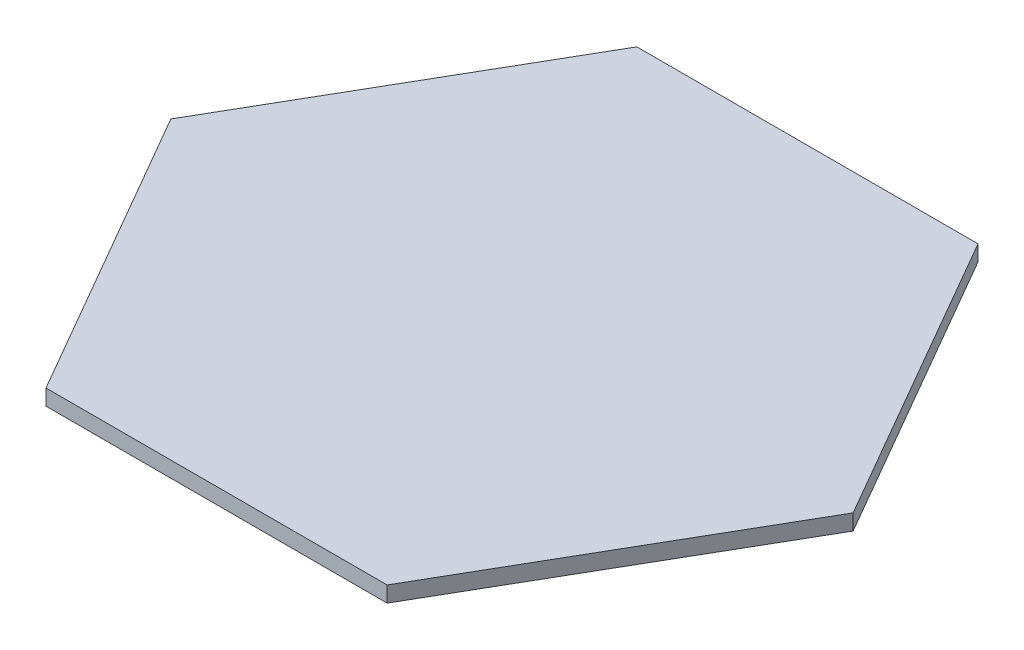
ISO-10303-21;
HEADER;
FILE_DESCRIPTION(('STEP AP214'),'2;1');
FILE_NAME('part.step','',(''),(''),'','','');
FILE_SCHEMA(('AUTOMOTIVE_DESIGN { 1 0 10303 214 1 1 1 1 }'));
ENDSEC;
DATA;
#1=APPLICATION_CONTEXT('core data for automotive mechanical design processes');
#2=APPLICATION_PROTOCOL_DEFINITION('international standard','automotive_design',2000,#1);
#3=PRODUCT_CONTEXT('',#1,'mechanical');
#4=PRODUCT('Part','Part','',(#3));
#5=PRODUCT_RELATED_PRODUCT_CATEGORY('part','',(#4));
#6=PRODUCT_DEFINITION_FORMATION('','',#4);
#7=PRODUCT_DEFINITION_CONTEXT('part definition',#1,'design');
#8=PRODUCT_DEFINITION('design','',#6,#7);
#9=PRODUCT_DEFINITION_SHAPE('','',#8);
#10=(LENGTH_UNIT() NAMED_UNIT(*) SI_UNIT(.MILLI.,.METRE.));
#11=(NAMED_UNIT(*) PLANE_ANGLE_UNIT() SI_UNIT($,.RADIAN.));
#12=(NAMED_UNIT(*) SI_UNIT($,.STERADIAN.) SOLID_ANGLE_UNIT());
#13=UNCERTAINTY_MEASURE_WITH_UNIT(LENGTH_MEASURE(1.E-05),#10,'distance_accuracy_value','');
#14=(GEOMETRIC_REPRESENTATION_CONTEXT(3) GLOBAL_UNCERTAINTY_ASSIGNED_CONTEXT((#13)) GLOBAL_UNIT_ASSIGNED_CONTEXT((#10,
#11,#12)) REPRESENTATION_CONTEXT('',''));
#15=CARTESIAN_POINT('',(0.,0.,0.));
#16=DIRECTION('',(0.,0.,1.));
#17=DIRECTION('',(1.,0.,0.));
#18=AXIS2_PLACEMENT_3D('',#15,#16,#17);
#19=CARTESIAN_POINT('',(32.5000000000007,3.,56.2916512459881));
#20=DIRECTION('',(-0.866025403784441,0.,-0.499999999999995));
#21=DIRECTION('',(-0.499999999999995,0.,0.866025403784442));
#22=AXIS2_PLACEMENT_3D('',#19,#20,#21);
#23=PLANE('',#22);
#24=DIRECTION('',(0.499999999999995,0.,-0.866025403784442));
#25=VECTOR('',#24,1.);
#26=CARTESIAN_POINT('',(32.5000000000007,0.,56.2916512459881));
#27=LINE('',#26,#25);
#28=CARTESIAN_POINT('',(32.5000000000007,0.,56.2916512459881));
#29=VERTEX_POINT('',#28);
#30=CARTESIAN_POINT('',(65.,0.,0.));
#31=VERTEX_POINT('',#30);
#32=EDGE_CURVE('E119',#29,#31,#27,.T.);
#33=ORIENTED_EDGE('',*,*,#32,.T.);
#34=DIRECTION('',(0.,-1.,0.));
#35=VECTOR('',#34,1.);
#36=CARTESIAN_POINT('',(65.,3.,0.));
#37=LINE('',#36,#35);
#38=CARTESIAN_POINT('',(65.,3.,0.));
#39=VERTEX_POINT('',#38);
#40=EDGE_CURVE('E11',#39,#31,#37,.T.);
#41=ORIENTED_EDGE('',*,*,#40,.F.);
#42=DIRECTION('',(0.499999999999995,0.,-0.866025403784442));
#43=VECTOR('',#42,1.);
#44=CARTESIAN_POINT('',(32.5000000000007,3.,56.2916512459881));
#45=LINE('',#44,#43);
#46=CARTESIAN_POINT('',(32.5000000000007,3.,56.2916512459881));
#47=VERTEX_POINT('',#46);
#48=EDGE_CURVE('E129',#47,#39,#45,.T.);
#49=ORIENTED_EDGE('',*,*,#48,.F.);
#50=DIRECTION('',(0.,-1.,0.));
#51=VECTOR('',#50,1.);
#52=CARTESIAN_POINT('',(32.5000000000007,3.,56.2916512459881));
#53=LINE('',#52,#51);
#54=EDGE_CURVE('E115',#47,#29,#53,.T.);
#55=ORIENTED_EDGE('',*,*,#54,.T.);
#56=EDGE_LOOP('',(#33,#41,#49,#55));
#57=FACE_BOUND('',#56,.T.);
#58=ADVANCED_FACE('F35',(#57),#23,.F.);
#59=CARTESIAN_POINT('',(65.,3.,0.));
#60=DIRECTION('',(-0.866025403784438,0.,0.500000000000001));
#61=DIRECTION('',(0.500000000000001,0.,0.866025403784438));
#62=AXIS2_PLACEMENT_3D('',#59,#60,#61);
#63=PLANE('',#62);
#64=DIRECTION('',(-0.500000000000001,0.,-0.866025403784438));
#65=VECTOR('',#64,1.);
#66=CARTESIAN_POINT('',(65.,0.,0.));
#67=LINE('',#66,#65);
#68=CARTESIAN_POINT('',(32.4999999999999,0.,-56.2916512459886));
#69=VERTEX_POINT('',#68);
#70=EDGE_CURVE('E122',#31,#69,#67,.T.);
#71=ORIENTED_EDGE('',*,*,#70,.T.);
#72=DIRECTION('',(0.,-1.,0.));
#73=VECTOR('',#72,1.);
#74=CARTESIAN_POINT('',(32.4999999999999,3.,-56.2916512459886));
#75=LINE('',#74,#73);
#76=CARTESIAN_POINT('',(32.4999999999999,3.,-56.2916512459886));
#77=VERTEX_POINT('',#76);
#78=EDGE_CURVE('E43',#77,#69,#75,.T.);
#79=ORIENTED_EDGE('',*,*,#78,.F.);
#80=DIRECTION('',(-0.500000000000001,0.,-0.866025403784438));
#81=VECTOR('',#80,1.);
#82=CARTESIAN_POINT('',(65.,3.,0.));
#83=LINE('',#82,#81);
#84=EDGE_CURVE('E88',#39,#77,#83,.T.);
#85=ORIENTED_EDGE('',*,*,#84,.F.);
#86=ORIENTED_EDGE('',*,*,#40,.T.);
#87=EDGE_LOOP('',(#71,#79,#85,#86));
#88=FACE_BOUND('',#87,.T.);
#89=ADVANCED_FACE('F153',(#88),#63,.F.);
#90=CARTESIAN_POINT('',(32.4999999999999,3.,-56.2916512459886));
#91=DIRECTION('',(0.,0.,1.));
#92=DIRECTION('',(1.,0.,0.));
#93=AXIS2_PLACEMENT_3D('',#90,#91,#92);
#94=PLANE('',#93);
#95=DIRECTION('',(-1.,0.,0.));
#96=VECTOR('',#95,1.);
#97=CARTESIAN_POINT('',(32.4999999999999,0.,-56.2916512459886));
#98=LINE('',#97,#96);
#99=CARTESIAN_POINT('',(-32.5000000000003,0.,-56.2916512459884));
#100=VERTEX_POINT('',#99);
#101=EDGE_CURVE('E124',#69,#100,#98,.T.);
#102=ORIENTED_EDGE('',*,*,#101,.T.);
#103=DIRECTION('',(0.,-1.,0.));
#104=VECTOR('',#103,1.);
#105=CARTESIAN_POINT('',(-32.5000000000003,3.,-56.2916512459884));
#106=LINE('',#105,#104);
#107=CARTESIAN_POINT('',(-32.5000000000003,3.,-56.2916512459884));
#108=VERTEX_POINT('',#107);
#109=EDGE_CURVE('E110',#108,#100,#106,.T.);
#110=ORIENTED_EDGE('',*,*,#109,.F.);
#111=DIRECTION('',(-1.,0.,0.));
#112=VECTOR('',#111,1.);
#113=CARTESIAN_POINT('',(32.4999999999999,3.,-56.2916512459886));
#114=LINE('',#113,#112);
#115=EDGE_CURVE('E101',#77,#108,#114,.T.);
#116=ORIENTED_EDGE('',*,*,#115,.F.);
#117=ORIENTED_EDGE('',*,*,#78,.T.);
#118=EDGE_LOOP('',(#102,#110,#116,#117));
#119=FACE_BOUND('',#118,.T.);
#120=ADVANCED_FACE('F135',(#119),#94,.F.);
#121=CARTESIAN_POINT('',(-32.5000000000003,3.,-56.2916512459884));
#122=DIRECTION('',(0.866025403784441,0.,0.499999999999995));
#123=DIRECTION('',(0.499999999999995,0.,-0.866025403784442));
#124=AXIS2_PLACEMENT_3D('',#121,#122,#123);
#125=PLANE('',#124);
#126=DIRECTION('',(-0.499999999999995,0.,0.866025403784442));
#127=VECTOR('',#126,1.);
#128=CARTESIAN_POINT('',(-32.5000000000003,0.,-56.2916512459884));
#129=LINE('',#128,#127);
#130=CARTESIAN_POINT('',(-65.,0.,4.53892574049607E-13));
#131=VERTEX_POINT('',#130);
#132=EDGE_CURVE('E109',#100,#131,#129,.T.);
#133=ORIENTED_EDGE('',*,*,#132,.T.);
#134=DIRECTION('',(0.,-1.,0.));
#135=VECTOR('',#134,1.);
#136=CARTESIAN_POINT('',(-65.,3.,4.53892574049607E-13));
#137=LINE('',#136,#135);
#138=CARTESIAN_POINT('',(-65.,3.,4.53892574049607E-13));
#139=VERTEX_POINT('',#138);
#140=EDGE_CURVE('E106',#139,#131,#137,.T.);
#141=ORIENTED_EDGE('',*,*,#140,.F.);
#142=DIRECTION('',(-0.499999999999995,0.,0.866025403784442));
#143=VECTOR('',#142,1.);
#144=CARTESIAN_POINT('',(-32.5000000000003,3.,-56.2916512459884));
#145=LINE('',#144,#143);
#146=EDGE_CURVE('E95',#108,#139,#145,.T.);
#147=ORIENTED_EDGE('',*,*,#146,.F.);
#148=ORIENTED_EDGE('',*,*,#109,.T.);
#149=EDGE_LOOP('',(#133,#141,#147,#148));
#150=FACE_BOUND('',#149,.T.);
#151=ADVANCED_FACE('F107',(#150),#125,.F.);
#152=CARTESIAN_POINT('',(-65.,3.,4.53892574049607E-13));
#153=DIRECTION('',(0.866025403784434,0.,-0.500000000000007));
#154=DIRECTION('',(-0.500000000000007,0.,-0.866025403784435));
#155=AXIS2_PLACEMENT_3D('',#152,#153,#154);
#156=PLANE('',#155);
#157=DIRECTION('',(0.500000000000007,0.,0.866025403784435));
#158=VECTOR('',#157,1.);
#159=CARTESIAN_POINT('',(-65.,0.,4.53892574049607E-13));
#160=LINE('',#159,#158);
#161=CARTESIAN_POINT('',(-32.4999999999995,0.,56.2916512459888));
#162=VERTEX_POINT('',#161);
#163=EDGE_CURVE('E74',#131,#162,#160,.T.);
#164=ORIENTED_EDGE('',*,*,#163,.T.);
#165=DIRECTION('',(0.,-1.,0.));
#166=VECTOR('',#165,1.);
#167=CARTESIAN_POINT('',(-32.4999999999995,3.,56.2916512459888));
#168=LINE('',#167,#166);
#169=CARTESIAN_POINT('',(-32.4999999999995,3.,56.2916512459888));
#170=VERTEX_POINT('',#169);
#171=EDGE_CURVE('E111',#170,#162,#168,.T.);
#172=ORIENTED_EDGE('',*,*,#171,.F.);
#173=DIRECTION('',(0.500000000000007,0.,0.866025403784435));
#174=VECTOR('',#173,1.);
#175=CARTESIAN_POINT('',(-65.,3.,4.53892574049607E-13));
#176=LINE('',#175,#174);
#177=EDGE_CURVE('E99',#139,#170,#176,.T.);
#178=ORIENTED_EDGE('',*,*,#177,.F.);
#179=ORIENTED_EDGE('',*,*,#140,.T.);
#180=EDGE_LOOP('',(#164,#172,#178,#179));
#181=FACE_BOUND('',#180,.T.);
#182=ADVANCED_FACE('F113',(#181),#156,.F.);
#183=CARTESIAN_POINT('',(-32.4999999999995,3.,56.2916512459888));
#184=DIRECTION('',(0.,0.,-1.));
#185=DIRECTION('',(-1.,0.,0.));
#186=AXIS2_PLACEMENT_3D('',#183,#184,#185);
#187=PLANE('',#186);
#188=DIRECTION('',(1.,0.,0.));
#189=VECTOR('',#188,1.);
#190=CARTESIAN_POINT('',(-32.4999999999995,0.,56.2916512459888));
#191=LINE('',#190,#189);
#192=EDGE_CURVE('E80',#162,#29,#191,.T.);
#193=ORIENTED_EDGE('',*,*,#192,.T.);
#194=ORIENTED_EDGE('',*,*,#54,.F.);
#195=DIRECTION('',(1.,0.,0.));
#196=VECTOR('',#195,1.);
#197=CARTESIAN_POINT('',(-32.4999999999995,3.,56.2916512459888));
#198=LINE('',#197,#196);
#199=EDGE_CURVE('E51',#170,#47,#198,.T.);
#200=ORIENTED_EDGE('',*,*,#199,.F.);
#201=ORIENTED_EDGE('',*,*,#171,.T.);
#202=EDGE_LOOP('',(#193,#194,#200,#201));
#203=FACE_BOUND('',#202,.T.);
#204=ADVANCED_FACE('F142',(#203),#187,.F.);
#205=CARTESIAN_POINT('',(0.,3.,0.));
#206=DIRECTION('',(0.,1.,0.));
#207=DIRECTION('',(0.,0.,1.));
#208=AXIS2_PLACEMENT_3D('',#205,#206,#207);
#209=PLANE('',#208);
#210=ORIENTED_EDGE('',*,*,#48,.T.);
#211=ORIENTED_EDGE('',*,*,#84,.T.);
#212=ORIENTED_EDGE('',*,*,#115,.T.);
#213=ORIENTED_EDGE('',*,*,#146,.T.);
#214=ORIENTED_EDGE('',*,*,#177,.T.);
#215=ORIENTED_EDGE('',*,*,#199,.T.);
#216=EDGE_LOOP('',(#210,#211,#212,#213,#214,#215));
#217=FACE_BOUND('',#216,.T.);
#218=ADVANCED_FACE('F97',(#217),#209,.T.);
#219=CARTESIAN_POINT('',(0.,0.,0.));
#220=DIRECTION('',(0.,1.,0.));
#221=DIRECTION('',(0.,0.,1.));
#222=AXIS2_PLACEMENT_3D('',#219,#220,#221);
#223=PLANE('',#222);
#224=ORIENTED_EDGE('',*,*,#32,.F.);
#225=ORIENTED_EDGE('',*,*,#192,.F.);
#226=ORIENTED_EDGE('',*,*,#163,.F.);
#227=ORIENTED_EDGE('',*,*,#132,.F.);
#228=ORIENTED_EDGE('',*,*,#101,.F.);
#229=ORIENTED_EDGE('',*,*,#70,.F.);
#230=EDGE_LOOP('',(#224,#225,#226,#227,#228,#229));
#231=FACE_BOUND('',#230,.T.);
#232=ADVANCED_FACE('F138',(#231),#223,.F.);
#233=CLOSED_SHELL('',(#58,#89,#120,#151,#182,#204,#218,#232));
#234=MANIFOLD_SOLID_BREP('B2',#233);
#235=ADVANCED_BREP_SHAPE_REPRESENTATION('',(#18,#234),#14);
#236=SHAPE_DEFINITION_REPRESENTATION(#9,#235);
ENDSEC;
END-ISO-10303-21;
